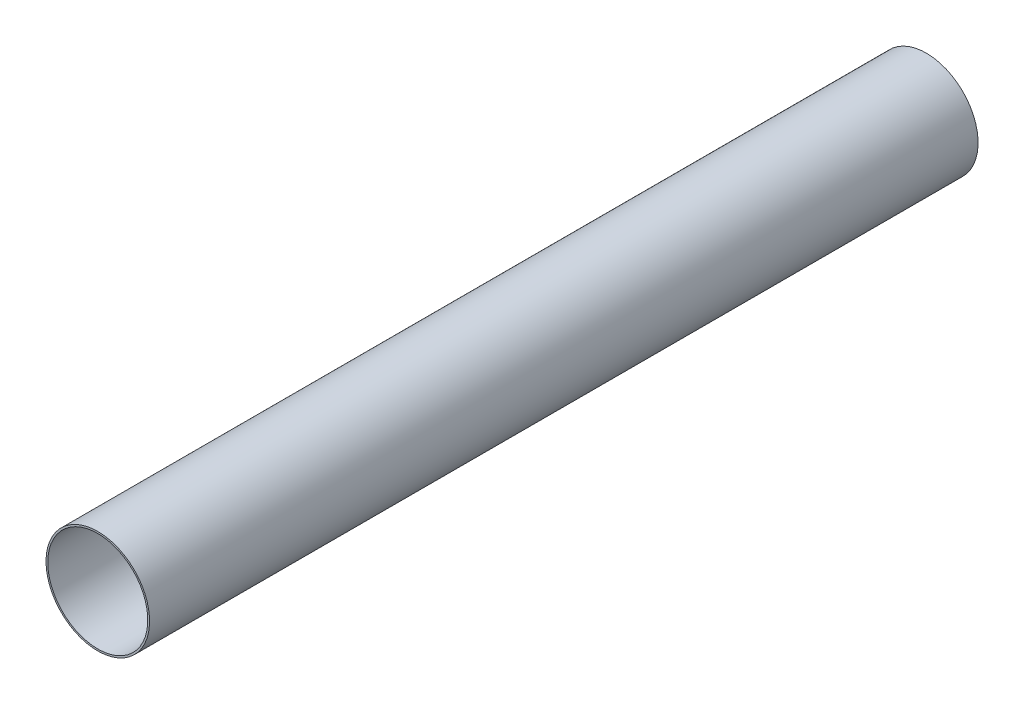
ISO-10303-21;
HEADER;
FILE_DESCRIPTION(('STEP AP214'),'2;1');
FILE_NAME('part.step','',(''),(''),'','','');
FILE_SCHEMA(('AUTOMOTIVE_DESIGN { 1 0 10303 214 1 1 1 1 }'));
ENDSEC;
DATA;
#1=APPLICATION_CONTEXT('core data for automotive mechanical design processes');
#2=APPLICATION_PROTOCOL_DEFINITION('international standard','automotive_design',2000,#1);
#3=PRODUCT_CONTEXT('',#1,'mechanical');
#4=PRODUCT('Part','Part','',(#3));
#5=PRODUCT_RELATED_PRODUCT_CATEGORY('part','',(#4));
#6=PRODUCT_DEFINITION_FORMATION('','',#4);
#7=PRODUCT_DEFINITION_CONTEXT('part definition',#1,'design');
#8=PRODUCT_DEFINITION('design','',#6,#7);
#9=PRODUCT_DEFINITION_SHAPE('','',#8);
#10=(LENGTH_UNIT() NAMED_UNIT(*) SI_UNIT(.MILLI.,.METRE.));
#11=(NAMED_UNIT(*) PLANE_ANGLE_UNIT() SI_UNIT($,.RADIAN.));
#12=(NAMED_UNIT(*) SI_UNIT($,.STERADIAN.) SOLID_ANGLE_UNIT());
#13=UNCERTAINTY_MEASURE_WITH_UNIT(LENGTH_MEASURE(1.E-05),#10,'distance_accuracy_value','');
#14=(GEOMETRIC_REPRESENTATION_CONTEXT(3) GLOBAL_UNCERTAINTY_ASSIGNED_CONTEXT((#13)) GLOBAL_UNIT_ASSIGNED_CONTEXT((#10,
#11,#12)) REPRESENTATION_CONTEXT('',''));
#15=CARTESIAN_POINT('',(0.,0.,0.));
#16=DIRECTION('',(0.,0.,1.));
#17=DIRECTION('',(1.,0.,0.));
#18=AXIS2_PLACEMENT_3D('',#15,#16,#17);
#19=CARTESIAN_POINT('',(0.,0.,1219.2));
#20=DIRECTION('',(0.,0.,1.));
#21=DIRECTION('',(1.,0.,0.));
#22=AXIS2_PLACEMENT_3D('',#19,#20,#21);
#23=PLANE('',#22);
#24=CARTESIAN_POINT('',(0.,0.,1219.2));
#25=DIRECTION('',(0.,0.,1.));
#26=DIRECTION('',(1.,0.,0.));
#27=AXIS2_PLACEMENT_3D('',#24,#25,#26);
#28=CIRCLE('',#27,76.2);
#29=CARTESIAN_POINT('',(-76.2,0.,1219.2));
#30=VERTEX_POINT('',#29);
#31=EDGE_CURVE('E11',#30,#30,#28,.T.);
#32=ORIENTED_EDGE('',*,*,#31,.T.);
#33=EDGE_LOOP('',(#32));
#34=FACE_BOUND('',#33,.T.);
#35=CARTESIAN_POINT('',(0.,0.,1219.2));
#36=DIRECTION('',(0.,0.,1.));
#37=DIRECTION('',(1.,0.,0.));
#38=AXIS2_PLACEMENT_3D('',#35,#36,#37);
#39=CIRCLE('',#38,73.6092);
#40=CARTESIAN_POINT('',(-73.6092,0.,1219.2));
#41=VERTEX_POINT('',#40);
#42=EDGE_CURVE('E48',#41,#41,#39,.T.);
#43=ORIENTED_EDGE('',*,*,#42,.F.);
#44=EDGE_LOOP('',(#43));
#45=FACE_BOUND('',#44,.T.);
#46=ADVANCED_FACE('F37',(#34,#45),#23,.T.);
#47=CARTESIAN_POINT('',(0.,0.,0.));
#48=DIRECTION('',(0.,0.,1.));
#49=DIRECTION('',(1.,0.,0.));
#50=AXIS2_PLACEMENT_3D('',#47,#48,#49);
#51=PLANE('',#50);
#52=CARTESIAN_POINT('',(0.,0.,0.));
#53=DIRECTION('',(0.,0.,1.));
#54=DIRECTION('',(1.,0.,0.));
#55=AXIS2_PLACEMENT_3D('',#52,#53,#54);
#56=CIRCLE('',#55,76.2);
#57=CARTESIAN_POINT('',(-76.2,0.,0.));
#58=VERTEX_POINT('',#57);
#59=EDGE_CURVE('E41',#58,#58,#56,.T.);
#60=ORIENTED_EDGE('',*,*,#59,.F.);
#61=EDGE_LOOP('',(#60));
#62=FACE_BOUND('',#61,.T.);
#63=CARTESIAN_POINT('',(0.,0.,0.));
#64=DIRECTION('',(0.,0.,1.));
#65=DIRECTION('',(1.,0.,0.));
#66=AXIS2_PLACEMENT_3D('',#63,#64,#65);
#67=CIRCLE('',#66,73.6092);
#68=CARTESIAN_POINT('',(-73.6092,0.,0.));
#69=VERTEX_POINT('',#68);
#70=EDGE_CURVE('E50',#69,#69,#67,.T.);
#71=ORIENTED_EDGE('',*,*,#70,.T.);
#72=EDGE_LOOP('',(#71));
#73=FACE_BOUND('',#72,.T.);
#74=ADVANCED_FACE('F60',(#62,#73),#51,.F.);
#75=CARTESIAN_POINT('',(0.,0.,1219.2));
#76=DIRECTION('',(0.,0.,-1.));
#77=DIRECTION('',(-1.,0.,0.));
#78=AXIS2_PLACEMENT_3D('',#75,#76,#77);
#79=CYLINDRICAL_SURFACE('',#78,76.2);
#80=CARTESIAN_POINT('',(-76.2,0.,1219.2));
#81=CARTESIAN_POINT('',(-76.2,0.,1206.5));
#82=CARTESIAN_POINT('',(-76.2,0.,1193.8));
#83=CARTESIAN_POINT('',(-76.2,0.,1168.4));
#84=CARTESIAN_POINT('',(-76.2,0.,1155.7));
#85=CARTESIAN_POINT('',(-76.2,0.,1130.3));
#86=CARTESIAN_POINT('',(-76.2,0.,1117.6));
#87=CARTESIAN_POINT('',(-76.2,0.,1092.2));
#88=CARTESIAN_POINT('',(-76.2,0.,1079.5));
#89=CARTESIAN_POINT('',(-76.2,0.,1054.1));
#90=CARTESIAN_POINT('',(-76.2,0.,1041.4));
#91=CARTESIAN_POINT('',(-76.2,0.,1016.));
#92=CARTESIAN_POINT('',(-76.2,0.,1003.3));
#93=CARTESIAN_POINT('',(-76.2,0.,977.9));
#94=CARTESIAN_POINT('',(-76.2,0.,965.2));
#95=CARTESIAN_POINT('',(-76.2,0.,939.8));
#96=CARTESIAN_POINT('',(-76.2,0.,927.1));
#97=CARTESIAN_POINT('',(-76.2,0.,901.7));
#98=CARTESIAN_POINT('',(-76.2,0.,889.));
#99=CARTESIAN_POINT('',(-76.2,0.,863.6));
#100=CARTESIAN_POINT('',(-76.2,0.,850.9));
#101=CARTESIAN_POINT('',(-76.2,0.,825.5));
#102=CARTESIAN_POINT('',(-76.2,0.,812.8));
#103=CARTESIAN_POINT('',(-76.2,0.,787.4));
#104=CARTESIAN_POINT('',(-76.2,0.,774.7));
#105=CARTESIAN_POINT('',(-76.2,0.,749.3));
#106=CARTESIAN_POINT('',(-76.2,0.,736.6));
#107=CARTESIAN_POINT('',(-76.2,0.,711.2));
#108=CARTESIAN_POINT('',(-76.2,0.,698.5));
#109=CARTESIAN_POINT('',(-76.2,0.,673.1));
#110=CARTESIAN_POINT('',(-76.2,0.,660.4));
#111=CARTESIAN_POINT('',(-76.2,0.,635.));
#112=CARTESIAN_POINT('',(-76.2,0.,622.3));
#113=CARTESIAN_POINT('',(-76.2,0.,596.9));
#114=CARTESIAN_POINT('',(-76.2,0.,584.2));
#115=CARTESIAN_POINT('',(-76.2,0.,558.8));
#116=CARTESIAN_POINT('',(-76.2,0.,546.1));
#117=CARTESIAN_POINT('',(-76.2,0.,520.7));
#118=CARTESIAN_POINT('',(-76.2,0.,508.));
#119=CARTESIAN_POINT('',(-76.2,0.,482.6));
#120=CARTESIAN_POINT('',(-76.2,0.,469.9));
#121=CARTESIAN_POINT('',(-76.2,0.,444.5));
#122=CARTESIAN_POINT('',(-76.2,0.,431.8));
#123=CARTESIAN_POINT('',(-76.2,0.,406.4));
#124=CARTESIAN_POINT('',(-76.2,0.,393.7));
#125=CARTESIAN_POINT('',(-76.2,0.,368.3));
#126=CARTESIAN_POINT('',(-76.2,0.,355.6));
#127=CARTESIAN_POINT('',(-76.2,0.,330.2));
#128=CARTESIAN_POINT('',(-76.2,0.,317.5));
#129=CARTESIAN_POINT('',(-76.2,0.,292.1));
#130=CARTESIAN_POINT('',(-76.2,0.,279.4));
#131=CARTESIAN_POINT('',(-76.2,0.,254.));
#132=CARTESIAN_POINT('',(-76.2,0.,241.3));
#133=CARTESIAN_POINT('',(-76.2,0.,215.9));
#134=CARTESIAN_POINT('',(-76.2,0.,203.2));
#135=CARTESIAN_POINT('',(-76.2,0.,177.8));
#136=CARTESIAN_POINT('',(-76.2,0.,165.1));
#137=CARTESIAN_POINT('',(-76.2,0.,139.7));
#138=CARTESIAN_POINT('',(-76.2,0.,127.));
#139=CARTESIAN_POINT('',(-76.2,0.,101.6));
#140=CARTESIAN_POINT('',(-76.2,0.,88.9));
#141=CARTESIAN_POINT('',(-76.2,0.,63.5));
#142=CARTESIAN_POINT('',(-76.2,0.,50.8));
#143=CARTESIAN_POINT('',(-76.2,0.,25.4));
#144=CARTESIAN_POINT('',(-76.2,0.,12.7));
#145=CARTESIAN_POINT('',(-76.2,0.,0.));
#146=B_SPLINE_CURVE_WITH_KNOTS('',3,(#80,#81,#82,#83,#84,#85,#86,#87,#88,#89,#90,#91,#92,#93,
#94,#95,#96,#97,#98,#99,#100,#101,#102,#103,#104,#105,#106,#107,#108,#109,#110,#111,#112,#113,
#114,#115,#116,#117,#118,#119,#120,#121,#122,#123,#124,#125,#126,#127,#128,#129,#130,#131,#132,
#133,#134,#135,#136,#137,#138,#139,#140,#141,#142,#143,#144,#145),.UNSPECIFIED.,.F.,.F.,(4,2,2,
2,2,2,2,2,2,2,2,2,2,2,2,2,2,2,2,2,2,2,2,2,2,2,2,2,2,2,2,2,4),(0.,38.1,76.2,114.3,152.4,190.5,
228.6,266.7,304.8,342.9,381.,419.1,457.2,495.3,533.4,571.5,609.6,647.7,685.8,723.9,762.,800.1,
838.2,876.3,914.4,952.5,990.6,1028.7,1066.8,1104.9,1143.,1181.1,1219.2),.UNSPECIFIED.);
#147=EDGE_CURVE('BSEAM39',#30,#58,#146,.T.);
#148=ORIENTED_EDGE('',*,*,#31,.F.);
#149=ORIENTED_EDGE('',*,*,#59,.T.);
#150=ORIENTED_EDGE('',*,*,#147,.T.);
#151=ORIENTED_EDGE('',*,*,#147,.F.);
#152=EDGE_LOOP('',(#148,#150,#149,#151));
#153=FACE_BOUND('',#152,.T.);
#154=ADVANCED_FACE('F39',(#153),#79,.T.);
#155=CARTESIAN_POINT('',(0.,0.,1219.2));
#156=DIRECTION('',(0.,0.,-1.));
#157=DIRECTION('',(-1.,0.,0.));
#158=AXIS2_PLACEMENT_3D('',#155,#156,#157);
#159=CYLINDRICAL_SURFACE('',#158,73.6092);
#160=CARTESIAN_POINT('',(-73.6092,0.,1219.2));
#161=CARTESIAN_POINT('',(-73.6092,0.,1206.5));
#162=CARTESIAN_POINT('',(-73.6092,0.,1193.8));
#163=CARTESIAN_POINT('',(-73.6092,0.,1168.4));
#164=CARTESIAN_POINT('',(-73.6092,0.,1155.7));
#165=CARTESIAN_POINT('',(-73.6092,0.,1130.3));
#166=CARTESIAN_POINT('',(-73.6092,0.,1117.6));
#167=CARTESIAN_POINT('',(-73.6092,0.,1092.2));
#168=CARTESIAN_POINT('',(-73.6092,0.,1079.5));
#169=CARTESIAN_POINT('',(-73.6092,0.,1054.1));
#170=CARTESIAN_POINT('',(-73.6092,0.,1041.4));
#171=CARTESIAN_POINT('',(-73.6092,0.,1016.));
#172=CARTESIAN_POINT('',(-73.6092,0.,1003.3));
#173=CARTESIAN_POINT('',(-73.6092,0.,977.9));
#174=CARTESIAN_POINT('',(-73.6092,0.,965.2));
#175=CARTESIAN_POINT('',(-73.6092,0.,939.8));
#176=CARTESIAN_POINT('',(-73.6092,0.,927.1));
#177=CARTESIAN_POINT('',(-73.6092,0.,901.7));
#178=CARTESIAN_POINT('',(-73.6092,0.,889.));
#179=CARTESIAN_POINT('',(-73.6092,0.,863.6));
#180=CARTESIAN_POINT('',(-73.6092,0.,850.9));
#181=CARTESIAN_POINT('',(-73.6092,0.,825.5));
#182=CARTESIAN_POINT('',(-73.6092,0.,812.8));
#183=CARTESIAN_POINT('',(-73.6092,0.,787.4));
#184=CARTESIAN_POINT('',(-73.6092,0.,774.7));
#185=CARTESIAN_POINT('',(-73.6092,0.,749.3));
#186=CARTESIAN_POINT('',(-73.6092,0.,736.6));
#187=CARTESIAN_POINT('',(-73.6092,0.,711.2));
#188=CARTESIAN_POINT('',(-73.6092,0.,698.5));
#189=CARTESIAN_POINT('',(-73.6092,0.,673.1));
#190=CARTESIAN_POINT('',(-73.6092,0.,660.4));
#191=CARTESIAN_POINT('',(-73.6092,0.,635.));
#192=CARTESIAN_POINT('',(-73.6092,0.,622.3));
#193=CARTESIAN_POINT('',(-73.6092,0.,596.9));
#194=CARTESIAN_POINT('',(-73.6092,0.,584.2));
#195=CARTESIAN_POINT('',(-73.6092,0.,558.8));
#196=CARTESIAN_POINT('',(-73.6092,0.,546.1));
#197=CARTESIAN_POINT('',(-73.6092,0.,520.7));
#198=CARTESIAN_POINT('',(-73.6092,0.,508.));
#199=CARTESIAN_POINT('',(-73.6092,0.,482.6));
#200=CARTESIAN_POINT('',(-73.6092,0.,469.9));
#201=CARTESIAN_POINT('',(-73.6092,0.,444.5));
#202=CARTESIAN_POINT('',(-73.6092,0.,431.8));
#203=CARTESIAN_POINT('',(-73.6092,0.,406.4));
#204=CARTESIAN_POINT('',(-73.6092,0.,393.7));
#205=CARTESIAN_POINT('',(-73.6092,0.,368.3));
#206=CARTESIAN_POINT('',(-73.6092,0.,355.6));
#207=CARTESIAN_POINT('',(-73.6092,0.,330.2));
#208=CARTESIAN_POINT('',(-73.6092,0.,317.5));
#209=CARTESIAN_POINT('',(-73.6092,0.,292.1));
#210=CARTESIAN_POINT('',(-73.6092,0.,279.4));
#211=CARTESIAN_POINT('',(-73.6092,0.,254.));
#212=CARTESIAN_POINT('',(-73.6092,0.,241.3));
#213=CARTESIAN_POINT('',(-73.6092,0.,215.9));
#214=CARTESIAN_POINT('',(-73.6092,0.,203.2));
#215=CARTESIAN_POINT('',(-73.6092,0.,177.8));
#216=CARTESIAN_POINT('',(-73.6092,0.,165.1));
#217=CARTESIAN_POINT('',(-73.6092,0.,139.7));
#218=CARTESIAN_POINT('',(-73.6092,0.,127.));
#219=CARTESIAN_POINT('',(-73.6092,0.,101.6));
#220=CARTESIAN_POINT('',(-73.6092,0.,88.9));
#221=CARTESIAN_POINT('',(-73.6092,0.,63.5));
#222=CARTESIAN_POINT('',(-73.6092,0.,50.8));
#223=CARTESIAN_POINT('',(-73.6092,0.,25.4));
#224=CARTESIAN_POINT('',(-73.6092,0.,12.7));
#225=CARTESIAN_POINT('',(-73.6092,0.,0.));
#226=B_SPLINE_CURVE_WITH_KNOTS('',3,(#160,#161,#162,#163,#164,#165,#166,#167,#168,#169,#170,
#171,#172,#173,#174,#175,#176,#177,#178,#179,#180,#181,#182,#183,#184,#185,#186,#187,#188,#189,
#190,#191,#192,#193,#194,#195,#196,#197,#198,#199,#200,#201,#202,#203,#204,#205,#206,#207,#208,
#209,#210,#211,#212,#213,#214,#215,#216,#217,#218,#219,#220,#221,#222,#223,#224,#225),
.UNSPECIFIED.,.F.,.F.,(4,2,2,2,2,2,2,2,2,2,2,2,2,2,2,2,2,2,2,2,2,2,2,2,2,2,2,2,2,2,2,2,4),(0.,
38.0999999999998,76.1999999999998,114.3,152.4,190.5,228.6,266.7,304.8,342.9,381.,419.1,457.2,
495.3,533.4,571.5,609.6,647.7,685.8,723.9,762.,800.1,838.2,876.3,914.4,952.5,990.6,1028.7,
1066.8,1104.9,1143.,1181.1,1219.2),.UNSPECIFIED.);
#227=EDGE_CURVE('BSEAM56',#41,#69,#226,.T.);
#228=ORIENTED_EDGE('',*,*,#42,.T.);
#229=ORIENTED_EDGE('',*,*,#70,.F.);
#230=ORIENTED_EDGE('',*,*,#227,.T.);
#231=ORIENTED_EDGE('',*,*,#227,.F.);
#232=EDGE_LOOP('',(#228,#230,#229,#231));
#233=FACE_BOUND('',#232,.T.);
#234=ADVANCED_FACE('F56',(#233),#159,.F.);
#235=CLOSED_SHELL('',(#46,#74,#154,#234));
#236=MANIFOLD_SOLID_BREP('B2',#235);
#237=ADVANCED_BREP_SHAPE_REPRESENTATION('',(#18,#236),#14);
#238=SHAPE_DEFINITION_REPRESENTATION(#9,#237);
ENDSEC;
END-ISO-10303-21;
